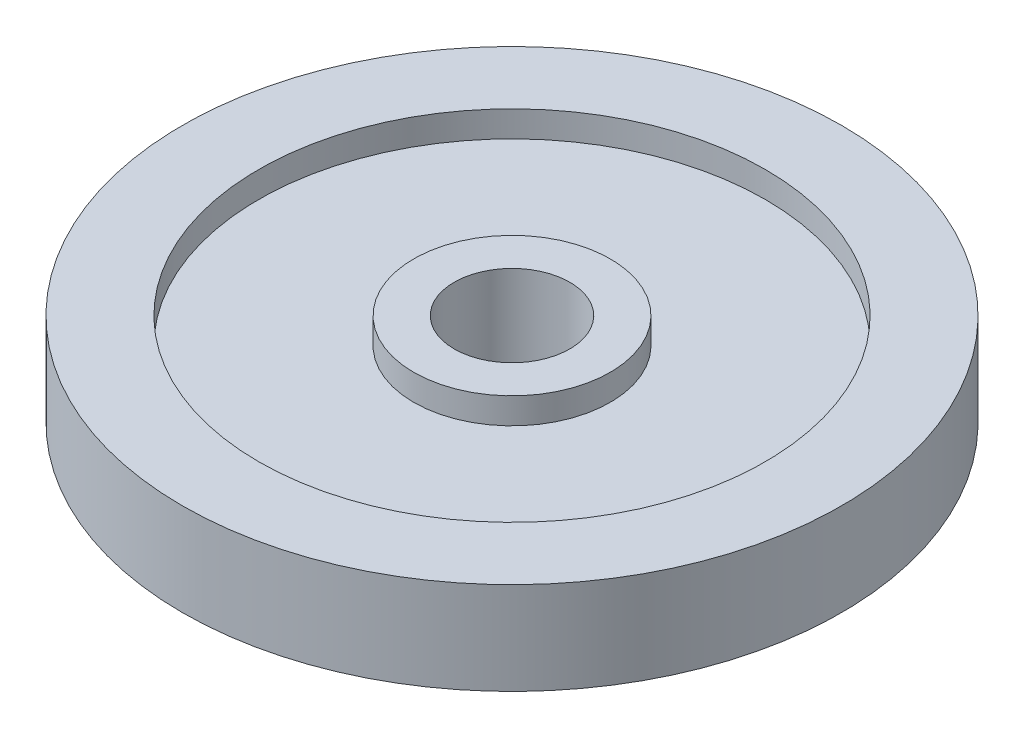
ISO-10303-21;
HEADER;
FILE_DESCRIPTION(('STEP AP214'),'2;1');
FILE_NAME('part.step','',(''),(''),'','','');
FILE_SCHEMA(('AUTOMOTIVE_DESIGN { 1 0 10303 214 1 1 1 1 }'));
ENDSEC;
DATA;
#1=APPLICATION_CONTEXT('core data for automotive mechanical design processes');
#2=APPLICATION_PROTOCOL_DEFINITION('international standard','automotive_design',2000,#1);
#3=PRODUCT_CONTEXT('',#1,'mechanical');
#4=PRODUCT('Part','Part','',(#3));
#5=PRODUCT_RELATED_PRODUCT_CATEGORY('part','',(#4));
#6=PRODUCT_DEFINITION_FORMATION('','',#4);
#7=PRODUCT_DEFINITION_CONTEXT('part definition',#1,'design');
#8=PRODUCT_DEFINITION('design','',#6,#7);
#9=PRODUCT_DEFINITION_SHAPE('','',#8);
#10=(LENGTH_UNIT() NAMED_UNIT(*) SI_UNIT(.MILLI.,.METRE.));
#11=(NAMED_UNIT(*) PLANE_ANGLE_UNIT() SI_UNIT($,.RADIAN.));
#12=(NAMED_UNIT(*) SI_UNIT($,.STERADIAN.) SOLID_ANGLE_UNIT());
#13=UNCERTAINTY_MEASURE_WITH_UNIT(LENGTH_MEASURE(1.E-05),#10,'distance_accuracy_value','');
#14=(GEOMETRIC_REPRESENTATION_CONTEXT(3) GLOBAL_UNCERTAINTY_ASSIGNED_CONTEXT((#13)) GLOBAL_UNIT_ASSIGNED_CONTEXT((#10,
#11,#12)) REPRESENTATION_CONTEXT('',''));
#15=CARTESIAN_POINT('',(0.,0.,0.));
#16=DIRECTION('',(0.,0.,1.));
#17=DIRECTION('',(1.,0.,0.));
#18=AXIS2_PLACEMENT_3D('',#15,#16,#17);
#19=CARTESIAN_POINT('',(0.,0.,0.));
#20=DIRECTION('',(0.,1.,0.));
#21=DIRECTION('',(0.,0.,1.));
#22=AXIS2_PLACEMENT_3D('',#19,#20,#21);
#23=PLANE('',#22);
#24=CARTESIAN_POINT('',(0.,0.,0.));
#25=DIRECTION('',(0.,1.,0.));
#26=DIRECTION('',(0.,0.,1.));
#27=AXIS2_PLACEMENT_3D('',#24,#25,#26);
#28=CIRCLE('',#27,6.35);
#29=CARTESIAN_POINT('',(0.,0.,6.35));
#30=VERTEX_POINT('',#29);
#31=EDGE_CURVE('E53',#30,#30,#28,.T.);
#32=ORIENTED_EDGE('',*,*,#31,.T.);
#33=EDGE_LOOP('',(#32));
#34=FACE_BOUND('',#33,.T.);
#35=CARTESIAN_POINT('',(0.,0.,0.));
#36=DIRECTION('',(0.,1.,0.));
#37=DIRECTION('',(0.,0.,1.));
#38=AXIS2_PLACEMENT_3D('',#35,#36,#37);
#39=CIRCLE('',#38,10.795);
#40=CARTESIAN_POINT('',(0.,0.,10.795));
#41=VERTEX_POINT('',#40);
#42=EDGE_CURVE('E83',#41,#41,#39,.T.);
#43=ORIENTED_EDGE('',*,*,#42,.F.);
#44=EDGE_LOOP('',(#43));
#45=FACE_BOUND('',#44,.T.);
#46=ADVANCED_FACE('F36',(#34,#45),#23,.F.);
#47=CARTESIAN_POINT('',(0.,10.16,0.));
#48=DIRECTION('',(0.,1.,0.));
#49=DIRECTION('',(0.,0.,1.));
#50=AXIS2_PLACEMENT_3D('',#47,#48,#49);
#51=PLANE('',#50);
#52=CARTESIAN_POINT('',(0.,10.16,0.));
#53=DIRECTION('',(0.,1.,0.));
#54=DIRECTION('',(0.,0.,1.));
#55=AXIS2_PLACEMENT_3D('',#52,#53,#54);
#56=CIRCLE('',#55,6.35);
#57=CARTESIAN_POINT('',(0.,10.16,6.35));
#58=VERTEX_POINT('',#57);
#59=EDGE_CURVE('E51',#58,#58,#56,.T.);
#60=ORIENTED_EDGE('',*,*,#59,.F.);
#61=EDGE_LOOP('',(#60));
#62=FACE_BOUND('',#61,.T.);
#63=CARTESIAN_POINT('',(0.,10.16,0.));
#64=DIRECTION('',(0.,1.,0.));
#65=DIRECTION('',(0.,0.,1.));
#66=AXIS2_PLACEMENT_3D('',#63,#64,#65);
#67=CIRCLE('',#66,10.795);
#68=CARTESIAN_POINT('',(0.,10.16,10.795));
#69=VERTEX_POINT('',#68);
#70=EDGE_CURVE('E68',#69,#69,#67,.T.);
#71=ORIENTED_EDGE('',*,*,#70,.T.);
#72=EDGE_LOOP('',(#71));
#73=FACE_BOUND('',#72,.T.);
#74=ADVANCED_FACE('F101',(#62,#73),#51,.T.);
#75=CARTESIAN_POINT('',(0.,10.16,0.));
#76=DIRECTION('',(0.,1.,0.));
#77=DIRECTION('',(0.,0.,1.));
#78=AXIS2_PLACEMENT_3D('',#75,#76,#77);
#79=CIRCLE('',#78,27.813);
#80=CARTESIAN_POINT('',(0.,10.16,27.813));
#81=VERTEX_POINT('',#80);
#82=EDGE_CURVE('E61',#81,#81,#79,.T.);
#83=ORIENTED_EDGE('',*,*,#82,.F.);
#84=EDGE_LOOP('',(#83));
#85=FACE_BOUND('',#84,.T.);
#86=CARTESIAN_POINT('',(0.,10.16,0.));
#87=DIRECTION('',(0.,1.,0.));
#88=DIRECTION('',(0.,0.,1.));
#89=AXIS2_PLACEMENT_3D('',#86,#87,#88);
#90=CIRCLE('',#89,36.195);
#91=CARTESIAN_POINT('',(0.,10.16,36.195));
#92=VERTEX_POINT('',#91);
#93=EDGE_CURVE('E10',#92,#92,#90,.T.);
#94=ORIENTED_EDGE('',*,*,#93,.T.);
#95=EDGE_LOOP('',(#94));
#96=FACE_BOUND('',#95,.T.);
#97=ADVANCED_FACE('F107',(#85,#96),#51,.T.);
#98=CARTESIAN_POINT('',(0.,0.,0.));
#99=DIRECTION('',(0.,1.,0.));
#100=DIRECTION('',(0.,0.,1.));
#101=AXIS2_PLACEMENT_3D('',#98,#99,#100);
#102=CIRCLE('',#101,27.813);
#103=CARTESIAN_POINT('',(0.,0.,27.813));
#104=VERTEX_POINT('',#103);
#105=EDGE_CURVE('E76',#104,#104,#102,.T.);
#106=ORIENTED_EDGE('',*,*,#105,.T.);
#107=EDGE_LOOP('',(#106));
#108=FACE_BOUND('',#107,.T.);
#109=CARTESIAN_POINT('',(0.,0.,0.));
#110=DIRECTION('',(0.,1.,0.));
#111=DIRECTION('',(0.,0.,1.));
#112=AXIS2_PLACEMENT_3D('',#109,#110,#111);
#113=CIRCLE('',#112,36.195);
#114=CARTESIAN_POINT('',(0.,0.,36.195));
#115=VERTEX_POINT('',#114);
#116=EDGE_CURVE('E40',#115,#115,#113,.T.);
#117=ORIENTED_EDGE('',*,*,#116,.F.);
#118=EDGE_LOOP('',(#117));
#119=FACE_BOUND('',#118,.T.);
#120=ADVANCED_FACE('F103',(#108,#119),#23,.F.);
#121=CARTESIAN_POINT('',(0.,10.16,0.));
#122=DIRECTION('',(0.,-1.,0.));
#123=DIRECTION('',(0.,0.,-1.));
#124=AXIS2_PLACEMENT_3D('',#121,#122,#123);
#125=CYLINDRICAL_SURFACE('',#124,36.195);
#126=ORIENTED_EDGE('',*,*,#93,.F.);
#127=EDGE_LOOP('',(#126));
#128=FACE_BOUND('',#127,.T.);
#129=ORIENTED_EDGE('',*,*,#116,.T.);
#130=EDGE_LOOP('',(#129));
#131=FACE_BOUND('',#130,.T.);
#132=ADVANCED_FACE('F38',(#128,#131),#125,.T.);
#133=CARTESIAN_POINT('',(0.,10.16,0.));
#134=DIRECTION('',(0.,-1.,0.));
#135=DIRECTION('',(0.,0.,-1.));
#136=AXIS2_PLACEMENT_3D('',#133,#134,#135);
#137=CYLINDRICAL_SURFACE('',#136,6.35);
#138=ORIENTED_EDGE('',*,*,#59,.T.);
#139=EDGE_LOOP('',(#138));
#140=FACE_BOUND('',#139,.T.);
#141=ORIENTED_EDGE('',*,*,#31,.F.);
#142=EDGE_LOOP('',(#141));
#143=FACE_BOUND('',#142,.T.);
#144=ADVANCED_FACE('F116',(#140,#143),#137,.F.);
#145=CARTESIAN_POINT('',(0.,7.3025,0.));
#146=DIRECTION('',(0.,1.,0.));
#147=DIRECTION('',(0.,0.,1.));
#148=AXIS2_PLACEMENT_3D('',#145,#146,#147);
#149=CYLINDRICAL_SURFACE('',#148,27.813);
#150=CARTESIAN_POINT('',(0.,7.3025,0.));
#151=DIRECTION('',(0.,1.,0.));
#152=DIRECTION('',(0.,0.,1.));
#153=AXIS2_PLACEMENT_3D('',#150,#151,#152);
#154=CIRCLE('',#153,27.813);
#155=CARTESIAN_POINT('',(0.,7.3025,27.813));
#156=VERTEX_POINT('',#155);
#157=EDGE_CURVE('E57',#156,#156,#154,.T.);
#158=ORIENTED_EDGE('',*,*,#157,.F.);
#159=EDGE_LOOP('',(#158));
#160=FACE_BOUND('',#159,.T.);
#161=ORIENTED_EDGE('',*,*,#82,.T.);
#162=EDGE_LOOP('',(#161));
#163=FACE_BOUND('',#162,.T.);
#164=ADVANCED_FACE('F140',(#160,#163),#149,.F.);
#165=CARTESIAN_POINT('',(0.,7.3025,0.));
#166=DIRECTION('',(0.,1.,0.));
#167=DIRECTION('',(0.,0.,1.));
#168=AXIS2_PLACEMENT_3D('',#165,#166,#167);
#169=PLANE('',#168);
#170=CARTESIAN_POINT('',(0.,7.3025,0.));
#171=DIRECTION('',(0.,1.,0.));
#172=DIRECTION('',(0.,0.,1.));
#173=AXIS2_PLACEMENT_3D('',#170,#171,#172);
#174=CIRCLE('',#173,10.795);
#175=CARTESIAN_POINT('',(0.,7.3025,10.795));
#176=VERTEX_POINT('',#175);
#177=EDGE_CURVE('E64',#176,#176,#174,.T.);
#178=ORIENTED_EDGE('',*,*,#177,.F.);
#179=EDGE_LOOP('',(#178));
#180=FACE_BOUND('',#179,.T.);
#181=ORIENTED_EDGE('',*,*,#157,.T.);
#182=EDGE_LOOP('',(#181));
#183=FACE_BOUND('',#182,.T.);
#184=ADVANCED_FACE('F136',(#180,#183),#169,.T.);
#185=CARTESIAN_POINT('',(0.,7.3025,0.));
#186=DIRECTION('',(0.,1.,0.));
#187=DIRECTION('',(0.,0.,1.));
#188=AXIS2_PLACEMENT_3D('',#185,#186,#187);
#189=CYLINDRICAL_SURFACE('',#188,10.795);
#190=ORIENTED_EDGE('',*,*,#177,.T.);
#191=EDGE_LOOP('',(#190));
#192=FACE_BOUND('',#191,.T.);
#193=ORIENTED_EDGE('',*,*,#70,.F.);
#194=EDGE_LOOP('',(#193));
#195=FACE_BOUND('',#194,.T.);
#196=ADVANCED_FACE('F130',(#192,#195),#189,.T.);
#197=CARTESIAN_POINT('',(0.,2.8575,0.));
#198=DIRECTION('',(0.,-1.,0.));
#199=DIRECTION('',(0.,0.,1.));
#200=AXIS2_PLACEMENT_3D('',#197,#198,#199);
#201=PLANE('',#200);
#202=CARTESIAN_POINT('',(0.,2.8575,0.));
#203=DIRECTION('',(0.,1.,0.));
#204=DIRECTION('',(0.,0.,1.));
#205=AXIS2_PLACEMENT_3D('',#202,#203,#204);
#206=CIRCLE('',#205,27.813);
#207=CARTESIAN_POINT('',(0.,2.8575,27.813));
#208=VERTEX_POINT('',#207);
#209=EDGE_CURVE('E72',#208,#208,#206,.T.);
#210=ORIENTED_EDGE('',*,*,#209,.F.);
#211=EDGE_LOOP('',(#210));
#212=FACE_BOUND('',#211,.T.);
#213=CARTESIAN_POINT('',(0.,2.8575,0.));
#214=DIRECTION('',(0.,1.,0.));
#215=DIRECTION('',(0.,0.,1.));
#216=AXIS2_PLACEMENT_3D('',#213,#214,#215);
#217=CIRCLE('',#216,10.795);
#218=CARTESIAN_POINT('',(0.,2.8575,10.795));
#219=VERTEX_POINT('',#218);
#220=EDGE_CURVE('E79',#219,#219,#217,.T.);
#221=ORIENTED_EDGE('',*,*,#220,.T.);
#222=EDGE_LOOP('',(#221));
#223=FACE_BOUND('',#222,.T.);
#224=ADVANCED_FACE('F91',(#212,#223),#201,.T.);
#225=CARTESIAN_POINT('',(0.,2.8575,0.));
#226=DIRECTION('',(0.,-1.,0.));
#227=DIRECTION('',(0.,0.,-1.));
#228=AXIS2_PLACEMENT_3D('',#225,#226,#227);
#229=CYLINDRICAL_SURFACE('',#228,27.813);
#230=ORIENTED_EDGE('',*,*,#209,.T.);
#231=EDGE_LOOP('',(#230));
#232=FACE_BOUND('',#231,.T.);
#233=ORIENTED_EDGE('',*,*,#105,.F.);
#234=EDGE_LOOP('',(#233));
#235=FACE_BOUND('',#234,.T.);
#236=ADVANCED_FACE('F96',(#232,#235),#229,.F.);
#237=CARTESIAN_POINT('',(0.,2.8575,0.));
#238=DIRECTION('',(0.,-1.,0.));
#239=DIRECTION('',(0.,0.,-1.));
#240=AXIS2_PLACEMENT_3D('',#237,#238,#239);
#241=CYLINDRICAL_SURFACE('',#240,10.795);
#242=ORIENTED_EDGE('',*,*,#220,.F.);
#243=EDGE_LOOP('',(#242));
#244=FACE_BOUND('',#243,.T.);
#245=ORIENTED_EDGE('',*,*,#42,.T.);
#246=EDGE_LOOP('',(#245));
#247=FACE_BOUND('',#246,.T.);
#248=ADVANCED_FACE('F93',(#244,#247),#241,.T.);
#249=CLOSED_SHELL('',(#46,#74,#97,#120,#132,#144,#164,#184,#196,#224,#236,#248));
#250=MANIFOLD_SOLID_BREP('B2',#249);
#251=ADVANCED_BREP_SHAPE_REPRESENTATION('',(#18,#250),#14);
#252=SHAPE_DEFINITION_REPRESENTATION(#9,#251);
ENDSEC;
END-ISO-10303-21;
